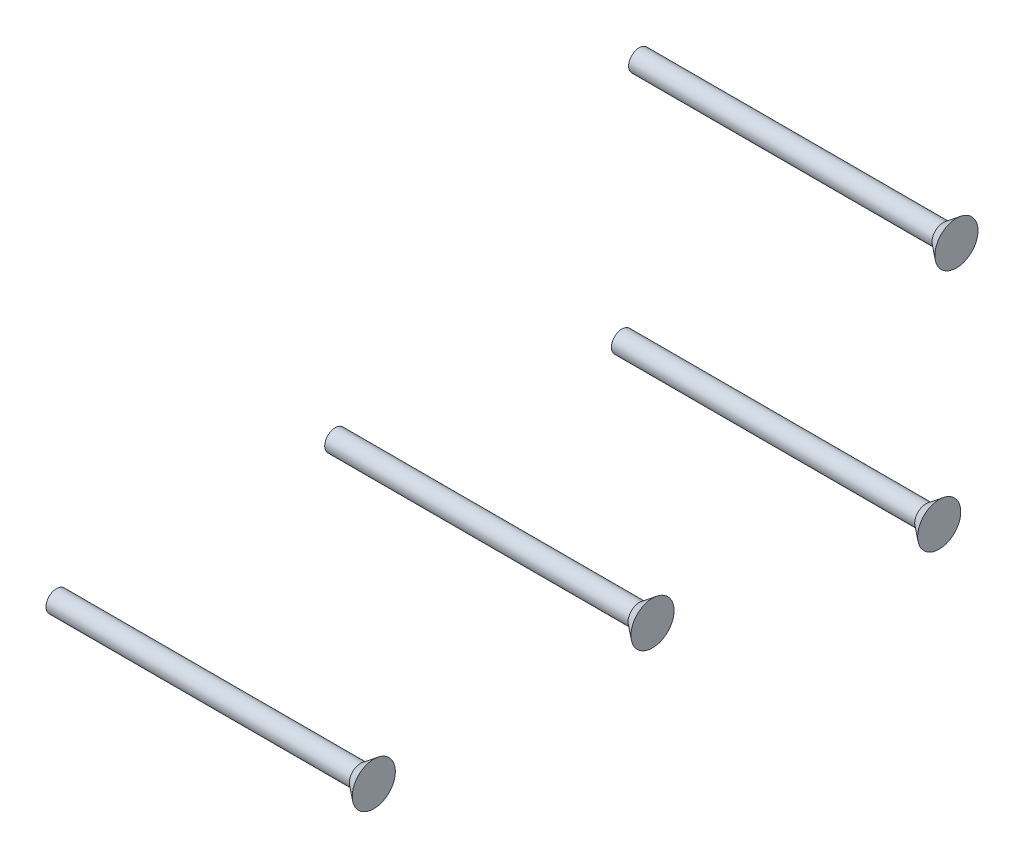
ISO-10303-21;
HEADER;
FILE_DESCRIPTION(('STEP AP214'),'2;1');
FILE_NAME('part.step','',(''),(''),'','','');
FILE_SCHEMA(('AUTOMOTIVE_DESIGN { 1 0 10303 214 1 1 1 1 }'));
ENDSEC;
DATA;
#1=APPLICATION_CONTEXT('core data for automotive mechanical design processes');
#2=APPLICATION_PROTOCOL_DEFINITION('international standard','automotive_design',2000,#1);
#3=PRODUCT_CONTEXT('',#1,'mechanical');
#4=PRODUCT('Part','Part','',(#3));
#5=PRODUCT_RELATED_PRODUCT_CATEGORY('part','',(#4));
#6=PRODUCT_DEFINITION_FORMATION('','',#4);
#7=PRODUCT_DEFINITION_CONTEXT('part definition',#1,'design');
#8=PRODUCT_DEFINITION('design','',#6,#7);
#9=PRODUCT_DEFINITION_SHAPE('','',#8);
#10=(LENGTH_UNIT() NAMED_UNIT(*) SI_UNIT(.MILLI.,.METRE.));
#11=(NAMED_UNIT(*) PLANE_ANGLE_UNIT() SI_UNIT($,.RADIAN.));
#12=(NAMED_UNIT(*) SI_UNIT($,.STERADIAN.) SOLID_ANGLE_UNIT());
#13=UNCERTAINTY_MEASURE_WITH_UNIT(LENGTH_MEASURE(1.E-05),#10,'distance_accuracy_value','');
#14=(GEOMETRIC_REPRESENTATION_CONTEXT(3) GLOBAL_UNCERTAINTY_ASSIGNED_CONTEXT((#13)) GLOBAL_UNIT_ASSIGNED_CONTEXT((#10,
#11,#12)) REPRESENTATION_CONTEXT('',''));
#15=CARTESIAN_POINT('',(0.,0.,0.));
#16=DIRECTION('',(0.,0.,1.));
#17=DIRECTION('',(1.,0.,0.));
#18=AXIS2_PLACEMENT_3D('',#15,#16,#17);
#19=CARTESIAN_POINT('',(60.706,33.88614,-58.166));
#20=DIRECTION('',(-1.,0.,0.));
#21=DIRECTION('',(0.,0.,1.));
#22=AXIS2_PLACEMENT_3D('',#19,#20,#21);
#23=CYLINDRICAL_SURFACE('',#22,2.032);
#24=CARTESIAN_POINT('',(0.,33.88614,-58.166));
#25=DIRECTION('',(1.,0.,0.));
#26=DIRECTION('',(0.,0.,-1.));
#27=AXIS2_PLACEMENT_3D('',#24,#25,#26);
#28=CIRCLE('',#27,2.032);
#29=CARTESIAN_POINT('',(0.,33.88614,-60.198));
#30=VERTEX_POINT('',#29);
#31=EDGE_CURVE('E52',#30,#30,#28,.T.);
#32=ORIENTED_EDGE('',*,*,#31,.T.);
#33=EDGE_LOOP('',(#32));
#34=FACE_BOUND('',#33,.T.);
#35=CARTESIAN_POINT('',(58.166,33.88614,-58.166));
#36=DIRECTION('',(1.,0.,0.));
#37=DIRECTION('',(0.,0.,-1.));
#38=AXIS2_PLACEMENT_3D('',#35,#36,#37);
#39=CIRCLE('',#38,2.032);
#40=CARTESIAN_POINT('',(58.166,33.88614,-60.198));
#41=VERTEX_POINT('',#40);
#42=EDGE_CURVE('E11',#41,#41,#39,.T.);
#43=ORIENTED_EDGE('',*,*,#42,.F.);
#44=EDGE_LOOP('',(#43));
#45=FACE_BOUND('',#44,.T.);
#46=ADVANCED_FACE('F46',(#34,#45),#23,.T.);
#47=CARTESIAN_POINT('',(0.,33.88614,-58.166));
#48=DIRECTION('',(1.,0.,0.));
#49=DIRECTION('',(0.,0.,-1.));
#50=AXIS2_PLACEMENT_3D('',#47,#48,#49);
#51=PLANE('',#50);
#52=ORIENTED_EDGE('',*,*,#31,.F.);
#53=EDGE_LOOP('',(#52));
#54=FACE_BOUND('',#53,.T.);
#55=ADVANCED_FACE('F71',(#54),#51,.F.);
#56=CARTESIAN_POINT('',(60.706,33.88614,-58.166));
#57=DIRECTION('',(1.,0.,0.));
#58=DIRECTION('',(0.,0.,-1.));
#59=AXIS2_PLACEMENT_3D('',#56,#57,#58);
#60=CONICAL_SURFACE('',#59,4.1275,0.663225115757847);
#61=CARTESIAN_POINT('',(58.166,33.88614,-58.166));
#62=DIRECTION('',(1.,0.,0.));
#63=DIRECTION('',(0.,0.,-1.));
#64=AXIS2_PLACEMENT_3D('',#61,#62,#63);
#65=CIRCLE('',#64,2.14303450867293);
#66=CARTESIAN_POINT('',(58.166,33.88614,-60.3090345086729));
#67=VERTEX_POINT('',#66);
#68=EDGE_CURVE('E56',#67,#67,#65,.T.);
#69=ORIENTED_EDGE('',*,*,#68,.T.);
#70=EDGE_LOOP('',(#69));
#71=FACE_BOUND('',#70,.T.);
#72=CARTESIAN_POINT('',(60.706,33.88614,-58.166));
#73=DIRECTION('',(1.,0.,0.));
#74=DIRECTION('',(0.,0.,-1.));
#75=AXIS2_PLACEMENT_3D('',#72,#73,#74);
#76=CIRCLE('',#75,4.1275);
#77=CARTESIAN_POINT('',(60.706,33.88614,-62.2935));
#78=VERTEX_POINT('',#77);
#79=EDGE_CURVE('E60',#78,#78,#76,.T.);
#80=ORIENTED_EDGE('',*,*,#79,.F.);
#81=EDGE_LOOP('',(#80));
#82=FACE_BOUND('',#81,.T.);
#83=ADVANCED_FACE('F68',(#71,#82),#60,.T.);
#84=CARTESIAN_POINT('',(58.166,33.88614,-58.166));
#85=DIRECTION('',(1.,0.,0.));
#86=DIRECTION('',(0.,0.,-1.));
#87=AXIS2_PLACEMENT_3D('',#84,#85,#86);
#88=PLANE('',#87);
#89=ORIENTED_EDGE('',*,*,#42,.T.);
#90=EDGE_LOOP('',(#89));
#91=FACE_BOUND('',#90,.T.);
#92=ORIENTED_EDGE('',*,*,#68,.F.);
#93=EDGE_LOOP('',(#92));
#94=FACE_BOUND('',#93,.T.);
#95=ADVANCED_FACE('F70',(#91,#94),#88,.F.);
#96=CARTESIAN_POINT('',(60.706,33.88614,-58.166));
#97=DIRECTION('',(1.,0.,0.));
#98=DIRECTION('',(0.,0.,-1.));
#99=AXIS2_PLACEMENT_3D('',#96,#97,#98);
#100=PLANE('',#99);
#101=ORIENTED_EDGE('',*,*,#79,.T.);
#102=EDGE_LOOP('',(#101));
#103=FACE_BOUND('',#102,.T.);
#104=ADVANCED_FACE('F66',(#103),#100,.T.);
#105=CLOSED_SHELL('',(#46,#55,#83,#95,#104));
#106=MANIFOLD_SOLID_BREP('B2',#105);
#107=CARTESIAN_POINT('',(60.706,-11.07186,-54.864));
#108=DIRECTION('',(-1.,0.,0.));
#109=DIRECTION('',(0.,0.,1.));
#110=AXIS2_PLACEMENT_3D('',#107,#108,#109);
#111=CYLINDRICAL_SURFACE('',#110,2.032);
#112=CARTESIAN_POINT('',(0.,-11.07186,-54.864));
#113=DIRECTION('',(1.,0.,0.));
#114=DIRECTION('',(0.,0.,-1.));
#115=AXIS2_PLACEMENT_3D('',#112,#113,#114);
#116=CIRCLE('',#115,2.032);
#117=CARTESIAN_POINT('',(0.,-11.07186,-56.896));
#118=VERTEX_POINT('',#117);
#119=EDGE_CURVE('E134',#118,#118,#116,.T.);
#120=ORIENTED_EDGE('',*,*,#119,.T.);
#121=EDGE_LOOP('',(#120));
#122=FACE_BOUND('',#121,.T.);
#123=CARTESIAN_POINT('',(58.166,-11.07186,-54.864));
#124=DIRECTION('',(1.,0.,0.));
#125=DIRECTION('',(0.,0.,-1.));
#126=AXIS2_PLACEMENT_3D('',#123,#124,#125);
#127=CIRCLE('',#126,2.032);
#128=CARTESIAN_POINT('',(58.166,-11.07186,-56.896));
#129=VERTEX_POINT('',#128);
#130=EDGE_CURVE('E45',#129,#129,#127,.T.);
#131=ORIENTED_EDGE('',*,*,#130,.F.);
#132=EDGE_LOOP('',(#131));
#133=FACE_BOUND('',#132,.T.);
#134=ADVANCED_FACE('F128',(#122,#133),#111,.T.);
#135=CARTESIAN_POINT('',(0.,-11.07186,-54.864));
#136=DIRECTION('',(1.,0.,0.));
#137=DIRECTION('',(0.,0.,-1.));
#138=AXIS2_PLACEMENT_3D('',#135,#136,#137);
#139=PLANE('',#138);
#140=ORIENTED_EDGE('',*,*,#119,.F.);
#141=EDGE_LOOP('',(#140));
#142=FACE_BOUND('',#141,.T.);
#143=ADVANCED_FACE('F153',(#142),#139,.F.);
#144=CARTESIAN_POINT('',(60.706,-11.07186,-54.864));
#145=DIRECTION('',(1.,0.,0.));
#146=DIRECTION('',(0.,0.,-1.));
#147=AXIS2_PLACEMENT_3D('',#144,#145,#146);
#148=CONICAL_SURFACE('',#147,4.1275,0.663225115757847);
#149=CARTESIAN_POINT('',(58.166,-11.07186,-54.864));
#150=DIRECTION('',(1.,0.,0.));
#151=DIRECTION('',(0.,0.,-1.));
#152=AXIS2_PLACEMENT_3D('',#149,#150,#151);
#153=CIRCLE('',#152,2.14303450867293);
#154=CARTESIAN_POINT('',(58.166,-11.07186,-57.0070345086729));
#155=VERTEX_POINT('',#154);
#156=EDGE_CURVE('E138',#155,#155,#153,.T.);
#157=ORIENTED_EDGE('',*,*,#156,.T.);
#158=EDGE_LOOP('',(#157));
#159=FACE_BOUND('',#158,.T.);
#160=CARTESIAN_POINT('',(60.706,-11.07186,-54.864));
#161=DIRECTION('',(1.,0.,0.));
#162=DIRECTION('',(0.,0.,-1.));
#163=AXIS2_PLACEMENT_3D('',#160,#161,#162);
#164=CIRCLE('',#163,4.1275);
#165=CARTESIAN_POINT('',(60.706,-11.07186,-58.9915));
#166=VERTEX_POINT('',#165);
#167=EDGE_CURVE('E142',#166,#166,#164,.T.);
#168=ORIENTED_EDGE('',*,*,#167,.F.);
#169=EDGE_LOOP('',(#168));
#170=FACE_BOUND('',#169,.T.);
#171=ADVANCED_FACE('F150',(#159,#170),#148,.T.);
#172=CARTESIAN_POINT('',(58.166,-11.07186,-54.864));
#173=DIRECTION('',(1.,0.,0.));
#174=DIRECTION('',(0.,0.,-1.));
#175=AXIS2_PLACEMENT_3D('',#172,#173,#174);
#176=PLANE('',#175);
#177=ORIENTED_EDGE('',*,*,#130,.T.);
#178=EDGE_LOOP('',(#177));
#179=FACE_BOUND('',#178,.T.);
#180=ORIENTED_EDGE('',*,*,#156,.F.);
#181=EDGE_LOOP('',(#180));
#182=FACE_BOUND('',#181,.T.);
#183=ADVANCED_FACE('F152',(#179,#182),#176,.F.);
#184=CARTESIAN_POINT('',(60.706,-11.07186,-54.864));
#185=DIRECTION('',(1.,0.,0.));
#186=DIRECTION('',(0.,0.,-1.));
#187=AXIS2_PLACEMENT_3D('',#184,#185,#186);
#188=PLANE('',#187);
#189=ORIENTED_EDGE('',*,*,#167,.T.);
#190=EDGE_LOOP('',(#189));
#191=FACE_BOUND('',#190,.T.);
#192=ADVANCED_FACE('F148',(#191),#188,.T.);
#193=CLOSED_SHELL('',(#134,#143,#171,#183,#192));
#194=MANIFOLD_SOLID_BREP('B6',#193);
#195=CARTESIAN_POINT('',(60.706,0.,0.));
#196=DIRECTION('',(-1.,0.,0.));
#197=DIRECTION('',(0.,0.,1.));
#198=AXIS2_PLACEMENT_3D('',#195,#196,#197);
#199=CYLINDRICAL_SURFACE('',#198,2.032);
#200=CARTESIAN_POINT('',(0.,0.,0.));
#201=DIRECTION('',(1.,0.,0.));
#202=DIRECTION('',(0.,0.,-1.));
#203=AXIS2_PLACEMENT_3D('',#200,#201,#202);
#204=CIRCLE('',#203,2.032);
#205=CARTESIAN_POINT('',(0.,0.,-2.032));
#206=VERTEX_POINT('',#205);
#207=EDGE_CURVE('E215',#206,#206,#204,.T.);
#208=ORIENTED_EDGE('',*,*,#207,.T.);
#209=EDGE_LOOP('',(#208));
#210=FACE_BOUND('',#209,.T.);
#211=CARTESIAN_POINT('',(58.166,0.,0.));
#212=DIRECTION('',(1.,0.,0.));
#213=DIRECTION('',(0.,0.,-1.));
#214=AXIS2_PLACEMENT_3D('',#211,#212,#213);
#215=CIRCLE('',#214,2.032);
#216=CARTESIAN_POINT('',(58.166,0.,-2.032));
#217=VERTEX_POINT('',#216);
#218=EDGE_CURVE('E127',#217,#217,#215,.T.);
#219=ORIENTED_EDGE('',*,*,#218,.F.);
#220=EDGE_LOOP('',(#219));
#221=FACE_BOUND('',#220,.T.);
#222=ADVANCED_FACE('F209',(#210,#221),#199,.T.);
#223=CARTESIAN_POINT('',(0.,0.,0.));
#224=DIRECTION('',(1.,0.,0.));
#225=DIRECTION('',(0.,0.,-1.));
#226=AXIS2_PLACEMENT_3D('',#223,#224,#225);
#227=PLANE('',#226);
#228=ORIENTED_EDGE('',*,*,#207,.F.);
#229=EDGE_LOOP('',(#228));
#230=FACE_BOUND('',#229,.T.);
#231=ADVANCED_FACE('F234',(#230),#227,.F.);
#232=CARTESIAN_POINT('',(60.706,0.,0.));
#233=DIRECTION('',(1.,0.,0.));
#234=DIRECTION('',(0.,0.,-1.));
#235=AXIS2_PLACEMENT_3D('',#232,#233,#234);
#236=CONICAL_SURFACE('',#235,4.1275,0.663225115757847);
#237=CARTESIAN_POINT('',(58.166,0.,0.));
#238=DIRECTION('',(1.,0.,0.));
#239=DIRECTION('',(0.,0.,-1.));
#240=AXIS2_PLACEMENT_3D('',#237,#238,#239);
#241=CIRCLE('',#240,2.14303450867293);
#242=CARTESIAN_POINT('',(58.166,0.,-2.14303450867293));
#243=VERTEX_POINT('',#242);
#244=EDGE_CURVE('E219',#243,#243,#241,.T.);
#245=ORIENTED_EDGE('',*,*,#244,.T.);
#246=EDGE_LOOP('',(#245));
#247=FACE_BOUND('',#246,.T.);
#248=CARTESIAN_POINT('',(60.706,0.,0.));
#249=DIRECTION('',(1.,0.,0.));
#250=DIRECTION('',(0.,0.,-1.));
#251=AXIS2_PLACEMENT_3D('',#248,#249,#250);
#252=CIRCLE('',#251,4.1275);
#253=CARTESIAN_POINT('',(60.706,0.,-4.1275));
#254=VERTEX_POINT('',#253);
#255=EDGE_CURVE('E223',#254,#254,#252,.T.);
#256=ORIENTED_EDGE('',*,*,#255,.F.);
#257=EDGE_LOOP('',(#256));
#258=FACE_BOUND('',#257,.T.);
#259=ADVANCED_FACE('F231',(#247,#258),#236,.T.);
#260=CARTESIAN_POINT('',(58.166,0.,0.));
#261=DIRECTION('',(1.,0.,0.));
#262=DIRECTION('',(0.,0.,-1.));
#263=AXIS2_PLACEMENT_3D('',#260,#261,#262);
#264=PLANE('',#263);
#265=ORIENTED_EDGE('',*,*,#218,.T.);
#266=EDGE_LOOP('',(#265));
#267=FACE_BOUND('',#266,.T.);
#268=ORIENTED_EDGE('',*,*,#244,.F.);
#269=EDGE_LOOP('',(#268));
#270=FACE_BOUND('',#269,.T.);
#271=ADVANCED_FACE('F233',(#267,#270),#264,.F.);
#272=CARTESIAN_POINT('',(60.706,0.,0.));
#273=DIRECTION('',(1.,0.,0.));
#274=DIRECTION('',(0.,0.,-1.));
#275=AXIS2_PLACEMENT_3D('',#272,#273,#274);
#276=PLANE('',#275);
#277=ORIENTED_EDGE('',*,*,#255,.T.);
#278=EDGE_LOOP('',(#277));
#279=FACE_BOUND('',#278,.T.);
#280=ADVANCED_FACE('F229',(#279),#276,.T.);
#281=CLOSED_SHELL('',(#222,#231,#259,#271,#280));
#282=MANIFOLD_SOLID_BREP('B40',#281);
#283=CARTESIAN_POINT('',(60.706,0.,53.34));
#284=DIRECTION('',(-1.,0.,0.));
#285=DIRECTION('',(0.,0.,1.));
#286=AXIS2_PLACEMENT_3D('',#283,#284,#285);
#287=CYLINDRICAL_SURFACE('',#286,2.032);
#288=CARTESIAN_POINT('',(0.,0.,53.34));
#289=DIRECTION('',(1.,0.,0.));
#290=DIRECTION('',(0.,0.,-1.));
#291=AXIS2_PLACEMENT_3D('',#288,#289,#290);
#292=CIRCLE('',#291,2.032);
#293=CARTESIAN_POINT('',(0.,0.,51.308));
#294=VERTEX_POINT('',#293);
#295=EDGE_CURVE('E290',#294,#294,#292,.T.);
#296=ORIENTED_EDGE('',*,*,#295,.T.);
#297=EDGE_LOOP('',(#296));
#298=FACE_BOUND('',#297,.T.);
#299=CARTESIAN_POINT('',(58.166,0.,53.34));
#300=DIRECTION('',(1.,0.,0.));
#301=DIRECTION('',(0.,0.,-1.));
#302=AXIS2_PLACEMENT_3D('',#299,#300,#301);
#303=CIRCLE('',#302,2.032);
#304=CARTESIAN_POINT('',(58.166,0.,51.308));
#305=VERTEX_POINT('',#304);
#306=EDGE_CURVE('E208',#305,#305,#303,.T.);
#307=ORIENTED_EDGE('',*,*,#306,.F.);
#308=EDGE_LOOP('',(#307));
#309=FACE_BOUND('',#308,.T.);
#310=ADVANCED_FACE('F283',(#298,#309),#287,.T.);
#311=CARTESIAN_POINT('',(0.,0.,53.34));
#312=DIRECTION('',(1.,0.,0.));
#313=DIRECTION('',(0.,0.,-1.));
#314=AXIS2_PLACEMENT_3D('',#311,#312,#313);
#315=PLANE('',#314);
#316=ORIENTED_EDGE('',*,*,#295,.F.);
#317=EDGE_LOOP('',(#316));
#318=FACE_BOUND('',#317,.T.);
#319=ADVANCED_FACE('F312',(#318),#315,.F.);
#320=CARTESIAN_POINT('',(60.706,0.,53.34));
#321=DIRECTION('',(1.,0.,0.));
#322=DIRECTION('',(0.,0.,-1.));
#323=AXIS2_PLACEMENT_3D('',#320,#321,#322);
#324=CONICAL_SURFACE('',#323,4.1275,0.663225115757847);
#325=CARTESIAN_POINT('',(58.166,0.,53.34));
#326=DIRECTION('',(1.,0.,0.));
#327=DIRECTION('',(0.,0.,-1.));
#328=AXIS2_PLACEMENT_3D('',#325,#326,#327);
#329=CIRCLE('',#328,2.14303450867293);
#330=CARTESIAN_POINT('',(58.166,0.,51.1969654913271));
#331=VERTEX_POINT('',#330);
#332=EDGE_CURVE('E295',#331,#331,#329,.T.);
#333=ORIENTED_EDGE('',*,*,#332,.T.);
#334=EDGE_LOOP('',(#333));
#335=FACE_BOUND('',#334,.T.);
#336=CARTESIAN_POINT('',(60.706,0.,53.34));
#337=DIRECTION('',(1.,0.,0.));
#338=DIRECTION('',(0.,0.,-1.));
#339=AXIS2_PLACEMENT_3D('',#336,#337,#338);
#340=CIRCLE('',#339,4.1275);
#341=CARTESIAN_POINT('',(60.706,0.,49.2125));
#342=VERTEX_POINT('',#341);
#343=EDGE_CURVE('E300',#342,#342,#340,.T.);
#344=ORIENTED_EDGE('',*,*,#343,.F.);
#345=EDGE_LOOP('',(#344));
#346=FACE_BOUND('',#345,.T.);
#347=ADVANCED_FACE('F309',(#335,#346),#324,.T.);
#348=CARTESIAN_POINT('',(58.166,0.,53.34));
#349=DIRECTION('',(1.,0.,0.));
#350=DIRECTION('',(0.,0.,-1.));
#351=AXIS2_PLACEMENT_3D('',#348,#349,#350);
#352=PLANE('',#351);
#353=ORIENTED_EDGE('',*,*,#306,.T.);
#354=EDGE_LOOP('',(#353));
#355=FACE_BOUND('',#354,.T.);
#356=ORIENTED_EDGE('',*,*,#332,.F.);
#357=EDGE_LOOP('',(#356));
#358=FACE_BOUND('',#357,.T.);
#359=ADVANCED_FACE('F311',(#355,#358),#352,.F.);
#360=CARTESIAN_POINT('',(60.706,0.,53.34));
#361=DIRECTION('',(1.,0.,0.));
#362=DIRECTION('',(0.,0.,-1.));
#363=AXIS2_PLACEMENT_3D('',#360,#361,#362);
#364=PLANE('',#363);
#365=ORIENTED_EDGE('',*,*,#343,.T.);
#366=EDGE_LOOP('',(#365));
#367=FACE_BOUND('',#366,.T.);
#368=ADVANCED_FACE('F307',(#367),#364,.T.);
#369=CLOSED_SHELL('',(#310,#319,#347,#359,#368));
#370=MANIFOLD_SOLID_BREP('B122',#369);
#371=ADVANCED_BREP_SHAPE_REPRESENTATION('',(#18,#106,#194,#282,#370),#14);
#372=SHAPE_DEFINITION_REPRESENTATION(#9,#371);
ENDSEC;
END-ISO-10303-21;
